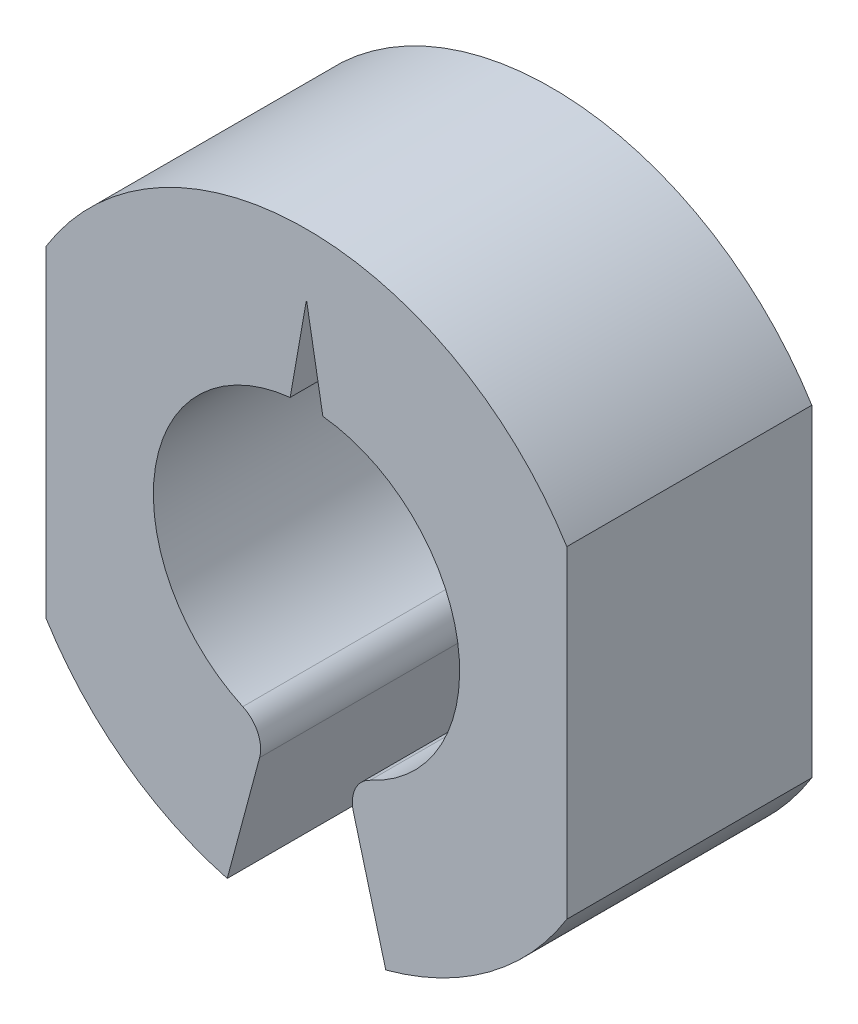
ISO-10303-21;
HEADER;
FILE_DESCRIPTION(('STEP AP214'),'2;1');
FILE_NAME('part.step','',(''),(''),'','','');
FILE_SCHEMA(('AUTOMOTIVE_DESIGN { 1 0 10303 214 1 1 1 1 }'));
ENDSEC;
DATA;
#1=APPLICATION_CONTEXT('core data for automotive mechanical design processes');
#2=APPLICATION_PROTOCOL_DEFINITION('international standard','automotive_design',2000,#1);
#3=PRODUCT_CONTEXT('',#1,'mechanical');
#4=PRODUCT('Part','Part','',(#3));
#5=PRODUCT_RELATED_PRODUCT_CATEGORY('part','',(#4));
#6=PRODUCT_DEFINITION_FORMATION('','',#4);
#7=PRODUCT_DEFINITION_CONTEXT('part definition',#1,'design');
#8=PRODUCT_DEFINITION('design','',#6,#7);
#9=PRODUCT_DEFINITION_SHAPE('','',#8);
#10=(LENGTH_UNIT() NAMED_UNIT(*) SI_UNIT(.MILLI.,.METRE.));
#11=(NAMED_UNIT(*) PLANE_ANGLE_UNIT() SI_UNIT($,.RADIAN.));
#12=(NAMED_UNIT(*) SI_UNIT($,.STERADIAN.) SOLID_ANGLE_UNIT());
#13=UNCERTAINTY_MEASURE_WITH_UNIT(LENGTH_MEASURE(1.E-05),#10,'distance_accuracy_value','');
#14=(GEOMETRIC_REPRESENTATION_CONTEXT(3) GLOBAL_UNCERTAINTY_ASSIGNED_CONTEXT((#13)) GLOBAL_UNIT_ASSIGNED_CONTEXT((#10,
#11,#12)) REPRESENTATION_CONTEXT('',''));
#15=CARTESIAN_POINT('',(0.,0.,0.));
#16=DIRECTION('',(0.,0.,1.));
#17=DIRECTION('',(1.,0.,0.));
#18=AXIS2_PLACEMENT_3D('',#15,#16,#17);
#19=CARTESIAN_POINT('',(0.,0.,8.));
#20=DIRECTION('',(0.,0.,-1.));
#21=DIRECTION('',(-1.,0.,0.));
#22=AXIS2_PLACEMENT_3D('',#19,#20,#21);
#23=CYLINDRICAL_SURFACE('',#22,5.);
#24=DIRECTION('',(0.,0.,-1.));
#25=VECTOR('',#24,1.);
#26=CARTESIAN_POINT('',(-0.534023884357983,4.97140005339896,8.));
#27=LINE('',#26,#25);
#28=CARTESIAN_POINT('',(-0.534023884357983,4.97140005339896,8.));
#29=VERTEX_POINT('',#28);
#30=CARTESIAN_POINT('',(-0.534023884357983,4.97140005339896,0.));
#31=VERTEX_POINT('',#30);
#32=EDGE_CURVE('E156',#29,#31,#27,.T.);
#33=ORIENTED_EDGE('',*,*,#32,.F.);
#34=CARTESIAN_POINT('',(0.,0.,8.));
#35=DIRECTION('',(0.,0.,-1.));
#36=DIRECTION('',(1.,0.,0.));
#37=AXIS2_PLACEMENT_3D('',#34,#35,#36);
#38=CIRCLE('',#37,5.);
#39=CARTESIAN_POINT('',(-2.08093328875103,-4.54639600648335,8.));
#40=VERTEX_POINT('',#39);
#41=EDGE_CURVE('E147',#40,#29,#38,.T.);
#42=ORIENTED_EDGE('',*,*,#41,.F.);
#43=DIRECTION('',(0.,0.,-1.));
#44=VECTOR('',#43,1.);
#45=CARTESIAN_POINT('',(-2.08093328875103,-4.54639600648335,8.));
#46=LINE('',#45,#44);
#47=CARTESIAN_POINT('',(-2.08093328875103,-4.54639600648335,0.));
#48=VERTEX_POINT('',#47);
#49=EDGE_CURVE('E206',#40,#48,#46,.T.);
#50=ORIENTED_EDGE('',*,*,#49,.T.);
#51=CARTESIAN_POINT('',(0.,0.,0.));
#52=DIRECTION('',(0.,0.,-1.));
#53=DIRECTION('',(1.,0.,0.));
#54=AXIS2_PLACEMENT_3D('',#51,#52,#53);
#55=CIRCLE('',#54,5.);
#56=EDGE_CURVE('E183',#48,#31,#55,.T.);
#57=ORIENTED_EDGE('',*,*,#56,.T.);
#58=EDGE_LOOP('',(#33,#42,#50,#57));
#59=FACE_BOUND('',#58,.T.);
#60=ADVANCED_FACE('F39',(#59),#23,.F.);
#61=CARTESIAN_POINT('',(0.,0.,8.));
#62=DIRECTION('',(0.,0.,1.));
#63=DIRECTION('',(1.,0.,0.));
#64=AXIS2_PLACEMENT_3D('',#61,#62,#63);
#65=PLANE('',#64);
#66=ORIENTED_EDGE('',*,*,#41,.T.);
#67=DIRECTION('',(0.173648177666931,0.984807753012208,0.));
#68=VECTOR('',#67,1.);
#69=CARTESIAN_POINT('',(0.,8.,8.));
#70=LINE('',#69,#68);
#71=CARTESIAN_POINT('',(0.,8.,8.));
#72=VERTEX_POINT('',#71);
#73=EDGE_CURVE('E133',#29,#72,#70,.T.);
#74=ORIENTED_EDGE('',*,*,#73,.T.);
#75=DIRECTION('',(0.173648177666931,-0.984807753012208,0.));
#76=VECTOR('',#75,1.);
#77=CARTESIAN_POINT('',(0.,8.,8.));
#78=LINE('',#77,#76);
#79=CARTESIAN_POINT('',(0.53402388435798,4.97140005339896,8.));
#80=VERTEX_POINT('',#79);
#81=EDGE_CURVE('E136',#72,#80,#78,.T.);
#82=ORIENTED_EDGE('',*,*,#81,.T.);
#83=CARTESIAN_POINT('',(2.08093328875104,-4.54639600648335,8.));
#84=VERTEX_POINT('',#83);
#85=EDGE_CURVE('E173',#80,#84,#38,.T.);
#86=ORIENTED_EDGE('',*,*,#85,.T.);
#87=CARTESIAN_POINT('',(2.49711994650124,-5.45567520778003,8.));
#88=DIRECTION('',(0.,0.,1.));
#89=DIRECTION('',(1.,0.,0.));
#90=AXIS2_PLACEMENT_3D('',#87,#88,#89);
#91=CIRCLE('',#90,1.);
#92=CARTESIAN_POINT('',(1.53119412021218,-5.71449425288255,8.));
#93=VERTEX_POINT('',#92);
#94=EDGE_CURVE('E216',#84,#93,#91,.T.);
#95=ORIENTED_EDGE('',*,*,#94,.T.);
#96=DIRECTION('',(0.258819045102522,-0.965925826289068,0.));
#97=VECTOR('',#96,1.);
#98=CARTESIAN_POINT('',(1.29409522551261,-4.82962913144534,8.));
#99=LINE('',#98,#97);
#100=CARTESIAN_POINT('',(2.58819045102522,-9.65925826289068,8.));
#101=VERTEX_POINT('',#100);
#102=EDGE_CURVE('E172',#93,#101,#99,.T.);
#103=ORIENTED_EDGE('',*,*,#102,.T.);
#104=CARTESIAN_POINT('',(0.,0.,8.));
#105=DIRECTION('',(0.,0.,1.));
#106=DIRECTION('',(1.,0.,0.));
#107=AXIS2_PLACEMENT_3D('',#104,#105,#106);
#108=CIRCLE('',#107,10.);
#109=CARTESIAN_POINT('',(8.5,-5.26782687642637,8.));
#110=VERTEX_POINT('',#109);
#111=EDGE_CURVE('E180',#101,#110,#108,.T.);
#112=ORIENTED_EDGE('',*,*,#111,.T.);
#113=DIRECTION('',(0.,-1.,0.));
#114=VECTOR('',#113,1.);
#115=CARTESIAN_POINT('',(8.5,5.26782687642637,8.));
#116=LINE('',#115,#114);
#117=CARTESIAN_POINT('',(8.5,5.26782687642637,8.));
#118=VERTEX_POINT('',#117);
#119=EDGE_CURVE('E162',#118,#110,#116,.T.);
#120=ORIENTED_EDGE('',*,*,#119,.F.);
#121=CARTESIAN_POINT('',(-8.5,5.26782687642637,8.));
#122=VERTEX_POINT('',#121);
#123=EDGE_CURVE('E182',#118,#122,#108,.T.);
#124=ORIENTED_EDGE('',*,*,#123,.T.);
#125=DIRECTION('',(0.,1.,0.));
#126=VECTOR('',#125,1.);
#127=CARTESIAN_POINT('',(-8.5,5.26782687642637,8.));
#128=LINE('',#127,#126);
#129=CARTESIAN_POINT('',(-8.5,-5.26782687642637,8.));
#130=VERTEX_POINT('',#129);
#131=EDGE_CURVE('E159',#130,#122,#128,.T.);
#132=ORIENTED_EDGE('',*,*,#131,.F.);
#133=CARTESIAN_POINT('',(-2.58819045102521,-9.65925826289068,8.));
#134=VERTEX_POINT('',#133);
#135=EDGE_CURVE('E177',#130,#134,#108,.T.);
#136=ORIENTED_EDGE('',*,*,#135,.T.);
#137=DIRECTION('',(0.258819045102521,0.965925826289068,0.));
#138=VECTOR('',#137,1.);
#139=CARTESIAN_POINT('',(-2.58819045102521,-9.65925826289068,8.));
#140=LINE('',#139,#138);
#141=CARTESIAN_POINT('',(-1.53119412021217,-5.71449425288255,8.));
#142=VERTEX_POINT('',#141);
#143=EDGE_CURVE('E178',#134,#142,#140,.T.);
#144=ORIENTED_EDGE('',*,*,#143,.T.);
#145=CARTESIAN_POINT('',(-2.49711994650124,-5.45567520778003,8.));
#146=DIRECTION('',(0.,0.,1.));
#147=DIRECTION('',(1.,0.,0.));
#148=AXIS2_PLACEMENT_3D('',#145,#146,#147);
#149=CIRCLE('',#148,1.);
#150=EDGE_CURVE('E217',#142,#40,#149,.T.);
#151=ORIENTED_EDGE('',*,*,#150,.T.);
#152=EDGE_LOOP('',(#66,#74,#82,#86,#95,#103,#112,#120,#124,#132,#136,#144,#151));
#153=FACE_BOUND('',#152,.T.);
#154=ADVANCED_FACE('F146',(#153),#65,.T.);
#155=CARTESIAN_POINT('',(0.,0.,0.));
#156=DIRECTION('',(0.,0.,1.));
#157=DIRECTION('',(1.,0.,0.));
#158=AXIS2_PLACEMENT_3D('',#155,#156,#157);
#159=PLANE('',#158);
#160=DIRECTION('',(0.173648177666931,0.984807753012208,0.));
#161=VECTOR('',#160,1.);
#162=CARTESIAN_POINT('',(0.,8.,0.));
#163=LINE('',#162,#161);
#164=CARTESIAN_POINT('',(0.,8.,0.));
#165=VERTEX_POINT('',#164);
#166=EDGE_CURVE('E53',#31,#165,#163,.T.);
#167=ORIENTED_EDGE('',*,*,#166,.F.);
#168=ORIENTED_EDGE('',*,*,#56,.F.);
#169=CARTESIAN_POINT('',(-2.49711994650124,-5.45567520778003,0.));
#170=DIRECTION('',(0.,0.,1.));
#171=DIRECTION('',(1.,0.,0.));
#172=AXIS2_PLACEMENT_3D('',#169,#170,#171);
#173=CIRCLE('',#172,1.);
#174=CARTESIAN_POINT('',(-1.53119412021217,-5.71449425288255,0.));
#175=VERTEX_POINT('',#174);
#176=EDGE_CURVE('E215',#48,#175,#173,.F.);
#177=ORIENTED_EDGE('',*,*,#176,.T.);
#178=DIRECTION('',(0.258819045102521,0.965925826289068,0.));
#179=VECTOR('',#178,1.);
#180=CARTESIAN_POINT('',(-2.58819045102521,-9.65925826289068,0.));
#181=LINE('',#180,#179);
#182=CARTESIAN_POINT('',(-2.58819045102521,-9.65925826289068,0.));
#183=VERTEX_POINT('',#182);
#184=EDGE_CURVE('E191',#183,#175,#181,.T.);
#185=ORIENTED_EDGE('',*,*,#184,.F.);
#186=CARTESIAN_POINT('',(0.,0.,0.));
#187=DIRECTION('',(0.,0.,1.));
#188=DIRECTION('',(1.,0.,0.));
#189=AXIS2_PLACEMENT_3D('',#186,#187,#188);
#190=CIRCLE('',#189,10.);
#191=CARTESIAN_POINT('',(-8.5,-5.26782687642637,0.));
#192=VERTEX_POINT('',#191);
#193=EDGE_CURVE('E189',#192,#183,#190,.T.);
#194=ORIENTED_EDGE('',*,*,#193,.F.);
#195=DIRECTION('',(0.,1.,0.));
#196=VECTOR('',#195,1.);
#197=CARTESIAN_POINT('',(-8.5,0.,0.));
#198=LINE('',#197,#196);
#199=CARTESIAN_POINT('',(-8.5,5.26782687642637,0.));
#200=VERTEX_POINT('',#199);
#201=EDGE_CURVE('E11',#192,#200,#198,.T.);
#202=ORIENTED_EDGE('',*,*,#201,.T.);
#203=CARTESIAN_POINT('',(8.5,5.26782687642637,0.));
#204=VERTEX_POINT('',#203);
#205=EDGE_CURVE('E193',#204,#200,#190,.T.);
#206=ORIENTED_EDGE('',*,*,#205,.F.);
#207=DIRECTION('',(0.,-1.,0.));
#208=VECTOR('',#207,1.);
#209=CARTESIAN_POINT('',(8.5,0.,0.));
#210=LINE('',#209,#208);
#211=CARTESIAN_POINT('',(8.5,-5.26782687642637,0.));
#212=VERTEX_POINT('',#211);
#213=EDGE_CURVE('E50',#204,#212,#210,.T.);
#214=ORIENTED_EDGE('',*,*,#213,.T.);
#215=CARTESIAN_POINT('',(2.58819045102522,-9.65925826289068,0.));
#216=VERTEX_POINT('',#215);
#217=EDGE_CURVE('E192',#216,#212,#190,.T.);
#218=ORIENTED_EDGE('',*,*,#217,.F.);
#219=DIRECTION('',(0.258819045102522,-0.965925826289068,0.));
#220=VECTOR('',#219,1.);
#221=CARTESIAN_POINT('',(1.29409522551261,-4.82962913144534,0.));
#222=LINE('',#221,#220);
#223=CARTESIAN_POINT('',(1.53119412021218,-5.71449425288255,0.));
#224=VERTEX_POINT('',#223);
#225=EDGE_CURVE('E187',#224,#216,#222,.T.);
#226=ORIENTED_EDGE('',*,*,#225,.F.);
#227=CARTESIAN_POINT('',(2.49711994650124,-5.45567520778003,0.));
#228=DIRECTION('',(0.,0.,1.));
#229=DIRECTION('',(1.,0.,0.));
#230=AXIS2_PLACEMENT_3D('',#227,#228,#229);
#231=CIRCLE('',#230,1.);
#232=CARTESIAN_POINT('',(2.08093328875104,-4.54639600648335,0.));
#233=VERTEX_POINT('',#232);
#234=EDGE_CURVE('E207',#224,#233,#231,.F.);
#235=ORIENTED_EDGE('',*,*,#234,.T.);
#236=CARTESIAN_POINT('',(0.53402388435798,4.97140005339896,0.));
#237=VERTEX_POINT('',#236);
#238=EDGE_CURVE('E164',#237,#233,#55,.T.);
#239=ORIENTED_EDGE('',*,*,#238,.F.);
#240=DIRECTION('',(0.173648177666931,-0.984807753012208,0.));
#241=VECTOR('',#240,1.);
#242=CARTESIAN_POINT('',(0.,8.,0.));
#243=LINE('',#242,#241);
#244=EDGE_CURVE('E151',#165,#237,#243,.T.);
#245=ORIENTED_EDGE('',*,*,#244,.F.);
#246=EDGE_LOOP('',(#167,#168,#177,#185,#194,#202,#206,#214,#218,#226,#235,#239,#245));
#247=FACE_BOUND('',#246,.T.);
#248=ADVANCED_FACE('F226',(#247),#159,.F.);
#249=CARTESIAN_POINT('',(0.,0.,8.));
#250=DIRECTION('',(0.,0.,-1.));
#251=DIRECTION('',(-1.,0.,0.));
#252=AXIS2_PLACEMENT_3D('',#249,#250,#251);
#253=CYLINDRICAL_SURFACE('',#252,10.);
#254=DIRECTION('',(0.,0.,1.));
#255=VECTOR('',#254,1.);
#256=CARTESIAN_POINT('',(-8.5,-5.26782687642637,-2.));
#257=LINE('',#256,#255);
#258=EDGE_CURVE('E165',#192,#130,#257,.T.);
#259=ORIENTED_EDGE('',*,*,#258,.F.);
#260=ORIENTED_EDGE('',*,*,#193,.T.);
#261=DIRECTION('',(0.,0.,-1.));
#262=VECTOR('',#261,1.);
#263=CARTESIAN_POINT('',(-2.58819045102521,-9.65925826289068,8.));
#264=LINE('',#263,#262);
#265=EDGE_CURVE('E184',#134,#183,#264,.T.);
#266=ORIENTED_EDGE('',*,*,#265,.F.);
#267=ORIENTED_EDGE('',*,*,#135,.F.);
#268=EDGE_LOOP('',(#259,#260,#266,#267));
#269=FACE_BOUND('',#268,.T.);
#270=ADVANCED_FACE('F260',(#269),#253,.T.);
#271=ORIENTED_EDGE('',*,*,#205,.T.);
#272=DIRECTION('',(0.,0.,1.));
#273=VECTOR('',#272,1.);
#274=CARTESIAN_POINT('',(-8.5,5.26782687642637,-2.));
#275=LINE('',#274,#273);
#276=EDGE_CURVE('E65',#200,#122,#275,.T.);
#277=ORIENTED_EDGE('',*,*,#276,.T.);
#278=ORIENTED_EDGE('',*,*,#123,.F.);
#279=DIRECTION('',(0.,0.,1.));
#280=VECTOR('',#279,1.);
#281=CARTESIAN_POINT('',(8.5,5.26782687642637,-2.));
#282=LINE('',#281,#280);
#283=EDGE_CURVE('E170',#204,#118,#282,.T.);
#284=ORIENTED_EDGE('',*,*,#283,.F.);
#285=EDGE_LOOP('',(#271,#277,#278,#284));
#286=FACE_BOUND('',#285,.T.);
#287=ADVANCED_FACE('F248',(#286),#253,.T.);
#288=ORIENTED_EDGE('',*,*,#85,.F.);
#289=DIRECTION('',(0.,0.,-1.));
#290=VECTOR('',#289,1.);
#291=CARTESIAN_POINT('',(0.53402388435798,4.97140005339896,8.));
#292=LINE('',#291,#290);
#293=EDGE_CURVE('E139',#80,#237,#292,.T.);
#294=ORIENTED_EDGE('',*,*,#293,.T.);
#295=ORIENTED_EDGE('',*,*,#238,.T.);
#296=DIRECTION('',(0.,0.,-1.));
#297=VECTOR('',#296,1.);
#298=CARTESIAN_POINT('',(2.08093328875104,-4.54639600648335,8.));
#299=LINE('',#298,#297);
#300=EDGE_CURVE('E201',#233,#84,#299,.F.);
#301=ORIENTED_EDGE('',*,*,#300,.T.);
#302=EDGE_LOOP('',(#288,#294,#295,#301));
#303=FACE_BOUND('',#302,.T.);
#304=ADVANCED_FACE('F243',(#303),#23,.F.);
#305=CARTESIAN_POINT('',(1.29409522551261,-4.82962913144534,8.));
#306=DIRECTION('',(0.965925826289068,0.258819045102522,0.));
#307=DIRECTION('',(-0.258819045102522,0.965925826289068,0.));
#308=AXIS2_PLACEMENT_3D('',#305,#306,#307);
#309=PLANE('',#308);
#310=ORIENTED_EDGE('',*,*,#102,.F.);
#311=DIRECTION('',(0.,0.,-1.));
#312=VECTOR('',#311,1.);
#313=CARTESIAN_POINT('',(1.53119412021218,-5.71449425288255,8.));
#314=LINE('',#313,#312);
#315=EDGE_CURVE('E219',#93,#224,#314,.T.);
#316=ORIENTED_EDGE('',*,*,#315,.T.);
#317=ORIENTED_EDGE('',*,*,#225,.T.);
#318=DIRECTION('',(0.,0.,-1.));
#319=VECTOR('',#318,1.);
#320=CARTESIAN_POINT('',(2.58819045102522,-9.65925826289068,8.));
#321=LINE('',#320,#319);
#322=EDGE_CURVE('E199',#101,#216,#321,.T.);
#323=ORIENTED_EDGE('',*,*,#322,.F.);
#324=EDGE_LOOP('',(#310,#316,#317,#323));
#325=FACE_BOUND('',#324,.T.);
#326=ADVANCED_FACE('F240',(#325),#309,.F.);
#327=ORIENTED_EDGE('',*,*,#217,.T.);
#328=DIRECTION('',(0.,0.,1.));
#329=VECTOR('',#328,1.);
#330=CARTESIAN_POINT('',(8.5,-5.26782687642637,-2.));
#331=LINE('',#330,#329);
#332=EDGE_CURVE('E158',#212,#110,#331,.T.);
#333=ORIENTED_EDGE('',*,*,#332,.T.);
#334=ORIENTED_EDGE('',*,*,#111,.F.);
#335=ORIENTED_EDGE('',*,*,#322,.T.);
#336=EDGE_LOOP('',(#327,#333,#334,#335));
#337=FACE_BOUND('',#336,.T.);
#338=ADVANCED_FACE('F235',(#337),#253,.T.);
#339=CARTESIAN_POINT('',(-2.58819045102521,-9.65925826289068,8.));
#340=DIRECTION('',(-0.965925826289068,0.258819045102521,0.));
#341=DIRECTION('',(-0.258819045102521,-0.965925826289068,0.));
#342=AXIS2_PLACEMENT_3D('',#339,#340,#341);
#343=PLANE('',#342);
#344=ORIENTED_EDGE('',*,*,#184,.T.);
#345=DIRECTION('',(0.,0.,-1.));
#346=VECTOR('',#345,1.);
#347=CARTESIAN_POINT('',(-1.53119412021217,-5.71449425288255,8.));
#348=LINE('',#347,#346);
#349=EDGE_CURVE('E212',#175,#142,#348,.F.);
#350=ORIENTED_EDGE('',*,*,#349,.T.);
#351=ORIENTED_EDGE('',*,*,#143,.F.);
#352=ORIENTED_EDGE('',*,*,#265,.T.);
#353=EDGE_LOOP('',(#344,#350,#351,#352));
#354=FACE_BOUND('',#353,.T.);
#355=ADVANCED_FACE('F261',(#354),#343,.F.);
#356=CARTESIAN_POINT('',(-2.49711994650124,-5.45567520778003,8.));
#357=DIRECTION('',(0.,0.,-1.));
#358=DIRECTION('',(-1.,0.,0.));
#359=AXIS2_PLACEMENT_3D('',#356,#357,#358);
#360=CYLINDRICAL_SURFACE('',#359,1.);
#361=ORIENTED_EDGE('',*,*,#150,.F.);
#362=ORIENTED_EDGE('',*,*,#349,.F.);
#363=ORIENTED_EDGE('',*,*,#176,.F.);
#364=ORIENTED_EDGE('',*,*,#49,.F.);
#365=EDGE_LOOP('',(#361,#362,#363,#364));
#366=FACE_BOUND('',#365,.T.);
#367=ADVANCED_FACE('F262',(#366),#360,.T.);
#368=CARTESIAN_POINT('',(2.49711994650124,-5.45567520778003,8.));
#369=DIRECTION('',(0.,0.,-1.));
#370=DIRECTION('',(-1.,0.,0.));
#371=AXIS2_PLACEMENT_3D('',#368,#369,#370);
#372=CYLINDRICAL_SURFACE('',#371,1.);
#373=ORIENTED_EDGE('',*,*,#94,.F.);
#374=ORIENTED_EDGE('',*,*,#300,.F.);
#375=ORIENTED_EDGE('',*,*,#234,.F.);
#376=ORIENTED_EDGE('',*,*,#315,.F.);
#377=EDGE_LOOP('',(#373,#374,#375,#376));
#378=FACE_BOUND('',#377,.T.);
#379=ADVANCED_FACE('F41',(#378),#372,.T.);
#380=CARTESIAN_POINT('',(8.5,5.26782687642637,-2.));
#381=DIRECTION('',(-1.,0.,0.));
#382=DIRECTION('',(0.,0.,1.));
#383=AXIS2_PLACEMENT_3D('',#380,#381,#382);
#384=PLANE('',#383);
#385=ORIENTED_EDGE('',*,*,#283,.T.);
#386=ORIENTED_EDGE('',*,*,#119,.T.);
#387=ORIENTED_EDGE('',*,*,#332,.F.);
#388=ORIENTED_EDGE('',*,*,#213,.F.);
#389=EDGE_LOOP('',(#385,#386,#387,#388));
#390=FACE_BOUND('',#389,.T.);
#391=ADVANCED_FACE('F269',(#390),#384,.F.);
#392=CARTESIAN_POINT('',(-8.5,5.26782687642637,-2.));
#393=DIRECTION('',(1.,0.,0.));
#394=DIRECTION('',(0.,0.,-1.));
#395=AXIS2_PLACEMENT_3D('',#392,#393,#394);
#396=PLANE('',#395);
#397=ORIENTED_EDGE('',*,*,#258,.T.);
#398=ORIENTED_EDGE('',*,*,#131,.T.);
#399=ORIENTED_EDGE('',*,*,#276,.F.);
#400=ORIENTED_EDGE('',*,*,#201,.F.);
#401=EDGE_LOOP('',(#397,#398,#399,#400));
#402=FACE_BOUND('',#401,.T.);
#403=ADVANCED_FACE('F268',(#402),#396,.F.);
#404=CARTESIAN_POINT('',(0.,8.,8.));
#405=DIRECTION('',(-0.984807753012208,0.173648177666931,0.));
#406=DIRECTION('',(-0.173648177666931,-0.984807753012208,0.));
#407=AXIS2_PLACEMENT_3D('',#404,#405,#406);
#408=PLANE('',#407);
#409=ORIENTED_EDGE('',*,*,#166,.T.);
#410=DIRECTION('',(0.,0.,-1.));
#411=VECTOR('',#410,1.);
#412=CARTESIAN_POINT('',(0.,8.,8.));
#413=LINE('',#412,#411);
#414=EDGE_CURVE('E128',#72,#165,#413,.T.);
#415=ORIENTED_EDGE('',*,*,#414,.F.);
#416=ORIENTED_EDGE('',*,*,#73,.F.);
#417=ORIENTED_EDGE('',*,*,#32,.T.);
#418=EDGE_LOOP('',(#409,#415,#416,#417));
#419=FACE_BOUND('',#418,.T.);
#420=ADVANCED_FACE('F135',(#419),#408,.F.);
#421=CARTESIAN_POINT('',(0.,8.,8.));
#422=DIRECTION('',(0.984807753012208,0.173648177666931,0.));
#423=DIRECTION('',(-0.173648177666931,0.984807753012208,0.));
#424=AXIS2_PLACEMENT_3D('',#421,#422,#423);
#425=PLANE('',#424);
#426=ORIENTED_EDGE('',*,*,#244,.T.);
#427=ORIENTED_EDGE('',*,*,#293,.F.);
#428=ORIENTED_EDGE('',*,*,#81,.F.);
#429=ORIENTED_EDGE('',*,*,#414,.T.);
#430=EDGE_LOOP('',(#426,#427,#428,#429));
#431=FACE_BOUND('',#430,.T.);
#432=ADVANCED_FACE('F142',(#431),#425,.F.);
#433=CLOSED_SHELL('',(#60,#154,#248,#270,#287,#304,#326,#338,#355,#367,#379,#391,#403,#420,#432));
#434=MANIFOLD_SOLID_BREP('B2',#433);
#435=ADVANCED_BREP_SHAPE_REPRESENTATION('',(#18,#434),#14);
#436=SHAPE_DEFINITION_REPRESENTATION(#9,#435);
ENDSEC;
END-ISO-10303-21;
